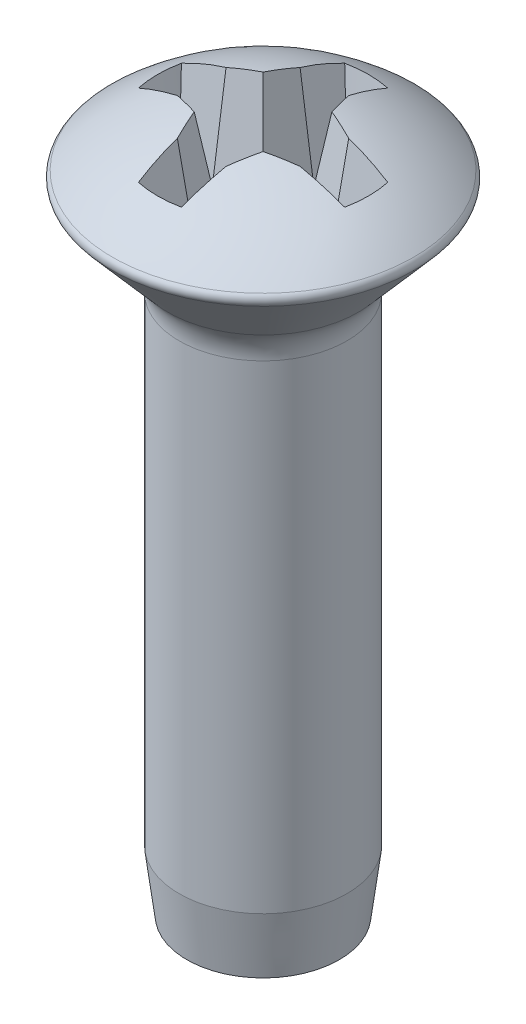
ISO-10303-21;
HEADER;
FILE_DESCRIPTION(('STEP AP214'),'2;1');
FILE_NAME('part.step','',(''),(''),'','','');
FILE_SCHEMA(('AUTOMOTIVE_DESIGN { 1 0 10303 214 1 1 1 1 }'));
ENDSEC;
DATA;
#1=APPLICATION_CONTEXT('core data for automotive mechanical design processes');
#2=APPLICATION_PROTOCOL_DEFINITION('international standard','automotive_design',2000,#1);
#3=PRODUCT_CONTEXT('',#1,'mechanical');
#4=PRODUCT('Part','Part','',(#3));
#5=PRODUCT_RELATED_PRODUCT_CATEGORY('part','',(#4));
#6=PRODUCT_DEFINITION_FORMATION('','',#4);
#7=PRODUCT_DEFINITION_CONTEXT('part definition',#1,'design');
#8=PRODUCT_DEFINITION('design','',#6,#7);
#9=PRODUCT_DEFINITION_SHAPE('','',#8);
#10=(LENGTH_UNIT() NAMED_UNIT(*) SI_UNIT(.MILLI.,.METRE.));
#11=(NAMED_UNIT(*) PLANE_ANGLE_UNIT() SI_UNIT($,.RADIAN.));
#12=(NAMED_UNIT(*) SI_UNIT($,.STERADIAN.) SOLID_ANGLE_UNIT());
#13=UNCERTAINTY_MEASURE_WITH_UNIT(LENGTH_MEASURE(1.E-05),#10,'distance_accuracy_value','');
#14=(GEOMETRIC_REPRESENTATION_CONTEXT(3) GLOBAL_UNCERTAINTY_ASSIGNED_CONTEXT((#13)) GLOBAL_UNIT_ASSIGNED_CONTEXT((#10,
#11,#12)) REPRESENTATION_CONTEXT('',''));
#15=CARTESIAN_POINT('',(0.,0.,0.));
#16=DIRECTION('',(0.,0.,1.));
#17=DIRECTION('',(1.,0.,0.));
#18=AXIS2_PLACEMENT_3D('',#15,#16,#17);
#19=CARTESIAN_POINT('',(0.,1.15804939418114,0.));
#20=DIRECTION('',(0.,-1.,0.));
#21=DIRECTION('',(0.,0.,-1.));
#22=AXIS2_PLACEMENT_3D('',#19,#20,#21);
#23=TOROIDAL_SURFACE('',#22,2.42533374712076,0.127);
#24=CARTESIAN_POINT('',(0.,1.25428371989489,0.));
#25=DIRECTION('',(0.,-1.,0.));
#26=DIRECTION('',(0.,0.,1.));
#27=AXIS2_PLACEMENT_3D('',#24,#25,#26);
#28=CIRCLE('',#27,2.50820687035393);
#29=CARTESIAN_POINT('',(0.,1.25428371989488,-2.50820687035393));
#30=VERTEX_POINT('',#29);
#31=EDGE_CURVE('E11',#30,#30,#28,.T.);
#32=ORIENTED_EDGE('',*,*,#31,.T.);
#33=EDGE_LOOP('',(#32));
#34=FACE_BOUND('',#33,.T.);
#35=CARTESIAN_POINT('',(0.,1.07472989749934,0.));
#36=DIRECTION('',(0.,1.,0.));
#37=DIRECTION('',(0.,0.,1.));
#38=AXIS2_PLACEMENT_3D('',#35,#36,#37);
#39=CIRCLE('',#38,2.52118186380905);
#40=CARTESIAN_POINT('',(0.,1.07472989749934,-2.52118186380905));
#41=VERTEX_POINT('',#40);
#42=EDGE_CURVE('E28',#41,#41,#39,.T.);
#43=ORIENTED_EDGE('',*,*,#42,.T.);
#44=EDGE_LOOP('',(#43));
#45=FACE_BOUND('',#44,.T.);
#46=ADVANCED_FACE('F17',(#34,#45),#23,.T.);
#47=CARTESIAN_POINT('',(0.,0.584713040357369,0.));
#48=DIRECTION('',(0.,1.,0.));
#49=DIRECTION('',(0.,0.,-1.));
#50=AXIS2_PLACEMENT_3D('',#47,#48,#49);
#51=CONICAL_SURFACE('',#50,2.09521670858914,0.715584993319999);
#52=CARTESIAN_POINT('',(0.,0.,0.));
#53=DIRECTION('',(0.,-1.,0.));
#54=DIRECTION('',(1.,0.,0.));
#55=AXIS2_PLACEMENT_3D('',#52,#53,#54);
#56=CIRCLE('',#55,1.58693341717828);
#57=CARTESIAN_POINT('',(0.,0.,-1.58693341717828));
#58=VERTEX_POINT('',#57);
#59=EDGE_CURVE('E353',#58,#58,#56,.T.);
#60=ORIENTED_EDGE('',*,*,#59,.F.);
#61=EDGE_LOOP('',(#60));
#62=FACE_BOUND('',#61,.T.);
#63=ORIENTED_EDGE('',*,*,#42,.F.);
#64=EDGE_LOOP('',(#63));
#65=FACE_BOUND('',#64,.T.);
#66=ADVANCED_FACE('F687',(#62,#65),#51,.T.);
#67=CARTESIAN_POINT('',(0.,-1.65830829428524,0.));
#68=DIRECTION('',(0.,0.,1.));
#69=DIRECTION('',(1.,0.,0.));
#70=AXIS2_PLACEMENT_3D('',#67,#68,#69);
#71=SPHERICAL_SURFACE('',#70,3.84373437499997);
#72=ORIENTED_EDGE('',*,*,#31,.F.);
#73=EDGE_LOOP('',(#72));
#74=FACE_BOUND('',#73,.T.);
#75=CARTESIAN_POINT('',(-0.0610638255064502,-1.66969899003309,0.0210795939230976));
#76=DIRECTION('',(-0.930902049821273,-0.17364817766693,0.321352896410639));
#77=DIRECTION('',(-0.326310282821926,0.,-0.94526271444751));
#78=AXIS2_PLACEMENT_3D('',#75,#76,#77);
#79=CIRCLE('',#78,3.84317460669449);
#80=CARTESIAN_POINT('',(-0.404857301362302,2.02498035128735,1.02165026525036));
#81=VERTEX_POINT('',#80);
#82=CARTESIAN_POINT('',(-0.573390965933572,2.09891668512816,0.57339096593357));
#83=VERTEX_POINT('',#82);
#84=EDGE_CURVE('E458',#81,#83,#79,.T.);
#85=ORIENTED_EDGE('',*,*,#84,.T.);
#86=CARTESIAN_POINT('',(-0.0210795939230979,-1.66969899003309,0.0610638255064509));
#87=DIRECTION('',(-0.321352896410639,-0.173648177666929,0.930902049821273));
#88=DIRECTION('',(0.,0.983043138329356,0.183374448011631));
#89=AXIS2_PLACEMENT_3D('',#86,#87,#88);
#90=CIRCLE('',#89,3.84317460669449);
#91=CARTESIAN_POINT('',(-1.02165026525037,2.02498035128735,0.404857301362299));
#92=VERTEX_POINT('',#91);
#93=EDGE_CURVE('E192',#83,#92,#90,.T.);
#94=ORIENTED_EDGE('',*,*,#93,.T.);
#95=CARTESIAN_POINT('',(0.,-1.61647822785268,-0.237230095272393));
#96=DIRECTION('',(0.,-0.173648177666929,0.984807753012208));
#97=DIRECTION('',(0.,0.984807753012208,0.173648177666929));
#98=AXIS2_PLACEMENT_3D('',#95,#96,#97);
#99=CIRCLE('',#98,3.8361785767865);
#100=CARTESIAN_POINT('',(-1.71837950576436,1.76120246910407,0.358346143819249));
#101=VERTEX_POINT('',#100);
#102=EDGE_CURVE('E203',#92,#101,#99,.T.);
#103=ORIENTED_EDGE('',*,*,#102,.T.);
#104=CARTESIAN_POINT('',(0.,1.76120246910407,0.));
#105=DIRECTION('',(0.,-1.,0.));
#106=DIRECTION('',(0.988094813743472,0.,0.153846153846154));
#107=AXIS2_PLACEMENT_3D('',#104,#105,#106);
#108=CIRCLE('',#107,1.75534614381925);
#109=CARTESIAN_POINT('',(-1.71837950576436,1.76120246910407,-0.358346143819256));
#110=VERTEX_POINT('',#109);
#111=EDGE_CURVE('E361',#101,#110,#108,.T.);
#112=ORIENTED_EDGE('',*,*,#111,.T.);
#113=CARTESIAN_POINT('',(0.,-1.61647822785268,0.237230095272398));
#114=DIRECTION('',(0.,-0.173648177666932,-0.984807753012208));
#115=DIRECTION('',(0.,-0.984807753012208,0.173648177666932));
#116=AXIS2_PLACEMENT_3D('',#113,#114,#115);
#117=CIRCLE('',#116,3.8361785767865);
#118=CARTESIAN_POINT('',(-1.02165026525037,2.02498035128735,-0.404857301362304));
#119=VERTEX_POINT('',#118);
#120=EDGE_CURVE('E383',#110,#119,#117,.T.);
#121=ORIENTED_EDGE('',*,*,#120,.T.);
#122=CARTESIAN_POINT('',(-0.0210795939230965,-1.66969899003309,-0.0610638255064471));
#123=DIRECTION('',(-0.321352896410639,-0.173648177666932,-0.930902049821272));
#124=DIRECTION('',(0.,-0.983043138329356,0.183374448011634));
#125=AXIS2_PLACEMENT_3D('',#122,#123,#124);
#126=CIRCLE('',#125,3.84317460669449);
#127=CARTESIAN_POINT('',(-0.573390965933572,2.09891668512816,-0.573390965933575));
#128=VERTEX_POINT('',#127);
#129=EDGE_CURVE('E481',#119,#128,#126,.T.);
#130=ORIENTED_EDGE('',*,*,#129,.T.);
#131=CARTESIAN_POINT('',(-0.0610638255064481,-1.66969899003309,-0.0210795939230969));
#132=DIRECTION('',(-0.930902049821273,-0.173648177666931,-0.321352896410639));
#133=DIRECTION('',(0.326310282821926,0.,-0.94526271444751));
#134=AXIS2_PLACEMENT_3D('',#131,#132,#133);
#135=CIRCLE('',#134,3.84317460669449);
#136=CARTESIAN_POINT('',(-0.404857301362302,2.02498035128734,-1.02165026525037));
#137=VERTEX_POINT('',#136);
#138=EDGE_CURVE('E488',#128,#137,#135,.T.);
#139=ORIENTED_EDGE('',*,*,#138,.T.);
#140=CARTESIAN_POINT('',(0.237230095272395,-1.61647822785268,0.));
#141=DIRECTION('',(-0.984807753012208,-0.17364817766693,0.));
#142=DIRECTION('',(0.,0.,-1.));
#143=AXIS2_PLACEMENT_3D('',#140,#141,#142);
#144=CIRCLE('',#143,3.8361785767865);
#145=CARTESIAN_POINT('',(-0.358346143819251,1.76120246910407,-1.71837950576437));
#146=VERTEX_POINT('',#145);
#147=EDGE_CURVE('E503',#137,#146,#144,.T.);
#148=ORIENTED_EDGE('',*,*,#147,.T.);
#149=CARTESIAN_POINT('',(0.,1.76120246910407,0.));
#150=DIRECTION('',(0.,-1.,0.));
#151=DIRECTION('',(-0.153846153846154,0.,0.988094813743472));
#152=AXIS2_PLACEMENT_3D('',#149,#150,#151);
#153=CIRCLE('',#152,1.75534614381925);
#154=CARTESIAN_POINT('',(0.358346143819251,1.76120246910407,-1.71837950576437));
#155=VERTEX_POINT('',#154);
#156=EDGE_CURVE('E219',#146,#155,#153,.T.);
#157=ORIENTED_EDGE('',*,*,#156,.T.);
#158=CARTESIAN_POINT('',(-0.237230095272395,-1.61647822785268,0.));
#159=DIRECTION('',(0.984807753012208,-0.17364817766693,0.));
#160=DIRECTION('',(0.,0.,1.));
#161=AXIS2_PLACEMENT_3D('',#158,#159,#160);
#162=CIRCLE('',#161,3.8361785767865);
#163=CARTESIAN_POINT('',(0.404857301362302,2.02498035128735,-1.02165026525037));
#164=VERTEX_POINT('',#163);
#165=EDGE_CURVE('E234',#155,#164,#162,.T.);
#166=ORIENTED_EDGE('',*,*,#165,.T.);
#167=CARTESIAN_POINT('',(0.0610638255064484,-1.66969899003309,-0.0210795939230971));
#168=DIRECTION('',(0.930902049821273,-0.173648177666931,-0.321352896410639));
#169=DIRECTION('',(0.326310282821926,0.,0.94526271444751));
#170=AXIS2_PLACEMENT_3D('',#167,#168,#169);
#171=CIRCLE('',#170,3.84317460669449);
#172=CARTESIAN_POINT('',(0.573390965933572,2.09891668512816,-0.573390965933575));
#173=VERTEX_POINT('',#172);
#174=EDGE_CURVE('E376',#164,#173,#171,.T.);
#175=ORIENTED_EDGE('',*,*,#174,.T.);
#176=CARTESIAN_POINT('',(0.0210795939230965,-1.66969899003309,-0.0610638255064469));
#177=DIRECTION('',(0.321352896410639,-0.173648177666932,-0.930902049821272));
#178=DIRECTION('',(0.,-0.983043138329356,0.183374448011634));
#179=AXIS2_PLACEMENT_3D('',#176,#177,#178);
#180=CIRCLE('',#179,3.84317460669449);
#181=CARTESIAN_POINT('',(1.02165026525037,2.02498035128735,-0.404857301362304));
#182=VERTEX_POINT('',#181);
#183=EDGE_CURVE('E372',#173,#182,#180,.T.);
#184=ORIENTED_EDGE('',*,*,#183,.T.);
#185=CARTESIAN_POINT('',(0.,-1.61647822785268,0.237230095272397));
#186=DIRECTION('',(0.,-0.173648177666932,-0.984807753012208));
#187=DIRECTION('',(0.,-0.984807753012208,0.173648177666932));
#188=AXIS2_PLACEMENT_3D('',#185,#186,#187);
#189=CIRCLE('',#188,3.8361785767865);
#190=CARTESIAN_POINT('',(1.71837950576436,1.76120246910407,-0.358346143819256));
#191=VERTEX_POINT('',#190);
#192=EDGE_CURVE('E365',#182,#191,#189,.T.);
#193=ORIENTED_EDGE('',*,*,#192,.T.);
#194=CARTESIAN_POINT('',(0.,1.76120246910407,0.));
#195=DIRECTION('',(0.,-1.,0.));
#196=DIRECTION('',(-0.988094813743472,0.,-0.153846153846154));
#197=AXIS2_PLACEMENT_3D('',#194,#195,#196);
#198=CIRCLE('',#197,1.75534614381925);
#199=CARTESIAN_POINT('',(1.71837950576436,1.76120246910407,0.358346143819249));
#200=VERTEX_POINT('',#199);
#201=EDGE_CURVE('E362',#191,#200,#198,.T.);
#202=ORIENTED_EDGE('',*,*,#201,.T.);
#203=CARTESIAN_POINT('',(0.,-1.61647822785268,-0.237230095272393));
#204=DIRECTION('',(0.,-0.173648177666929,0.984807753012208));
#205=DIRECTION('',(0.,0.984807753012208,0.173648177666929));
#206=AXIS2_PLACEMENT_3D('',#203,#204,#205);
#207=CIRCLE('',#206,3.8361785767865);
#208=CARTESIAN_POINT('',(1.02165026525037,2.02498035128735,0.404857301362299));
#209=VERTEX_POINT('',#208);
#210=EDGE_CURVE('E315',#200,#209,#207,.T.);
#211=ORIENTED_EDGE('',*,*,#210,.T.);
#212=CARTESIAN_POINT('',(0.0210795939230981,-1.66969899003309,0.0610638255064514));
#213=DIRECTION('',(0.321352896410639,-0.173648177666929,0.930902049821273));
#214=DIRECTION('',(0.,0.983043138329356,0.183374448011631));
#215=AXIS2_PLACEMENT_3D('',#212,#213,#214);
#216=CIRCLE('',#215,3.84317460669449);
#217=CARTESIAN_POINT('',(0.573390965933572,2.09891668512816,0.57339096593357));
#218=VERTEX_POINT('',#217);
#219=EDGE_CURVE('E309',#209,#218,#216,.T.);
#220=ORIENTED_EDGE('',*,*,#219,.T.);
#221=CARTESIAN_POINT('',(0.0610638255064497,-1.66969899003309,0.0210795939230975));
#222=DIRECTION('',(0.930902049821273,-0.17364817766693,0.321352896410639));
#223=DIRECTION('',(-0.326310282821926,0.,0.94526271444751));
#224=AXIS2_PLACEMENT_3D('',#221,#222,#223);
#225=CIRCLE('',#224,3.84317460669449);
#226=CARTESIAN_POINT('',(0.404857301362302,2.02498035128735,1.02165026525037));
#227=VERTEX_POINT('',#226);
#228=EDGE_CURVE('E299',#218,#227,#225,.T.);
#229=ORIENTED_EDGE('',*,*,#228,.T.);
#230=CARTESIAN_POINT('',(-0.237230095272395,-1.61647822785268,0.));
#231=DIRECTION('',(0.984807753012208,-0.17364817766693,0.));
#232=DIRECTION('',(0.,0.,1.));
#233=AXIS2_PLACEMENT_3D('',#230,#231,#232);
#234=CIRCLE('',#233,3.8361785767865);
#235=CARTESIAN_POINT('',(0.358346143819251,1.76120246910407,1.71837950576436));
#236=VERTEX_POINT('',#235);
#237=EDGE_CURVE('E310',#227,#236,#234,.T.);
#238=ORIENTED_EDGE('',*,*,#237,.T.);
#239=CARTESIAN_POINT('',(0.,1.76120246910407,0.));
#240=DIRECTION('',(0.,-1.,0.));
#241=DIRECTION('',(0.153846153846154,0.,-0.988094813743472));
#242=AXIS2_PLACEMENT_3D('',#239,#240,#241);
#243=CIRCLE('',#242,1.75534614381925);
#244=CARTESIAN_POINT('',(-0.358346143819251,1.76120246910407,1.71837950576436));
#245=VERTEX_POINT('',#244);
#246=EDGE_CURVE('E67',#236,#245,#243,.T.);
#247=ORIENTED_EDGE('',*,*,#246,.T.);
#248=CARTESIAN_POINT('',(0.237230095272395,-1.61647822785268,0.));
#249=DIRECTION('',(-0.984807753012208,-0.17364817766693,0.));
#250=DIRECTION('',(0.,0.,-1.));
#251=AXIS2_PLACEMENT_3D('',#248,#249,#250);
#252=CIRCLE('',#251,3.8361785767865);
#253=EDGE_CURVE('E81',#245,#81,#252,.T.);
#254=ORIENTED_EDGE('',*,*,#253,.T.);
#255=EDGE_LOOP('',(#85,#94,#103,#112,#121,#130,#139,#148,#157,#166,#175,#184,#193,#202,#211,
#220,#229,#238,#247,#254));
#256=FACE_BOUND('',#255,.T.);
#257=ADVANCED_FACE('F313',(#74,#256),#71,.T.);
#258=CARTESIAN_POINT('',(-0.99634453749047,1.16942608071473,-0.254));
#259=DIRECTION('',(-0.321352896410639,-0.173648177666932,-0.930902049821272));
#260=DIRECTION('',(-0.94526271444751,0.,0.326310282821926));
#261=AXIS2_PLACEMENT_3D('',#258,#259,#260);
#262=PLANE('',#261);
#263=DIRECTION('',(0.136076471219968,-0.98130850804456,0.136076471219973));
#264=VECTOR('',#263,1.);
#265=CARTESIAN_POINT('',(-0.447845473353487,1.1935517905879,-0.447845473353495));
#266=LINE('',#265,#264);
#267=CARTESIAN_POINT('',(-0.338834686574519,0.407426080714733,-0.338834686574521));
#268=VERTEX_POINT('',#267);
#269=EDGE_CURVE('E480',#128,#268,#266,.T.);
#270=ORIENTED_EDGE('',*,*,#269,.F.);
#271=ORIENTED_EDGE('',*,*,#129,.F.);
#272=DIRECTION('',(0.0291164590928139,-0.984390220157491,0.173574555359313));
#273=VECTOR('',#272,1.);
#274=CARTESIAN_POINT('',(-0.996613703890828,1.1785262522453,-0.255604605769916));
#275=LINE('',#274,#273);
#276=CARTESIAN_POINT('',(-0.973805973642108,0.407426080714733,-0.11963884070015));
#277=VERTEX_POINT('',#276);
#278=EDGE_CURVE('E342',#119,#277,#275,.T.);
#279=ORIENTED_EDGE('',*,*,#278,.T.);
#280=DIRECTION('',(0.94526271444751,0.,-0.326310282821926));
#281=VECTOR('',#280,1.);
#282=CARTESIAN_POINT('',(-0.921082730186928,0.407426080714733,-0.137839216341968));
#283=LINE('',#282,#281);
#284=EDGE_CURVE('E351',#277,#268,#283,.T.);
#285=ORIENTED_EDGE('',*,*,#284,.T.);
#286=EDGE_LOOP('',(#270,#271,#279,#285));
#287=FACE_BOUND('',#286,.T.);
#288=ADVANCED_FACE('F704',(#287),#262,.F.);
#289=CARTESIAN_POINT('',(0.,-9.49857391928526,0.));
#290=DIRECTION('',(0.,-1.,0.));
#291=DIRECTION('',(-1.,0.,0.));
#292=AXIS2_PLACEMENT_3D('',#289,#290,#291);
#293=PLANE('',#292);
#294=CARTESIAN_POINT('',(0.,-9.49857391928526,0.));
#295=DIRECTION('',(0.,-1.,0.));
#296=DIRECTION('',(1.,0.,0.));
#297=AXIS2_PLACEMENT_3D('',#294,#295,#296);
#298=CIRCLE('',#297,1.27000000000002);
#299=CARTESIAN_POINT('',(0.,-9.49857391928526,-1.27));
#300=VERTEX_POINT('',#299);
#301=EDGE_CURVE('E389',#300,#300,#298,.T.);
#302=ORIENTED_EDGE('',*,*,#301,.T.);
#303=EDGE_LOOP('',(#302));
#304=FACE_BOUND('',#303,.T.);
#305=ADVANCED_FACE('F711',(#304),#293,.T.);
#306=CARTESIAN_POINT('',(0.,-8.99057391928526,0.));
#307=DIRECTION('',(0.,1.,0.));
#308=DIRECTION('',(0.,0.,-1.));
#309=AXIS2_PLACEMENT_3D('',#306,#307,#308);
#310=CONICAL_SURFACE('',#309,1.33350000000002,0.124354994547168);
#311=CARTESIAN_POINT('',(0.,-8.48257391928526,0.));
#312=DIRECTION('',(0.,-1.,0.));
#313=DIRECTION('',(1.,0.,0.));
#314=AXIS2_PLACEMENT_3D('',#311,#312,#313);
#315=CIRCLE('',#314,1.39700000000002);
#316=CARTESIAN_POINT('',(0.,-8.48257391928526,-1.397));
#317=VERTEX_POINT('',#316);
#318=EDGE_CURVE('E392',#317,#317,#315,.T.);
#319=ORIENTED_EDGE('',*,*,#318,.T.);
#320=EDGE_LOOP('',(#319));
#321=FACE_BOUND('',#320,.T.);
#322=ORIENTED_EDGE('',*,*,#301,.F.);
#323=EDGE_LOOP('',(#322));
#324=FACE_BOUND('',#323,.T.);
#325=ADVANCED_FACE('F668',(#321,#324),#310,.T.);
#326=CARTESIAN_POINT('',(0.,-4.49528695964265,0.));
#327=DIRECTION('',(0.,-1.,0.));
#328=DIRECTION('',(0.,0.,-1.));
#329=AXIS2_PLACEMENT_3D('',#326,#327,#328);
#330=CYLINDRICAL_SURFACE('',#329,1.397);
#331=CARTESIAN_POINT('',(0.,-0.508,0.));
#332=DIRECTION('',(0.,-1.,0.));
#333=DIRECTION('',(1.,0.,0.));
#334=AXIS2_PLACEMENT_3D('',#331,#332,#333);
#335=CIRCLE('',#334,1.397);
#336=CARTESIAN_POINT('',(0.,-0.508,-1.397));
#337=VERTEX_POINT('',#336);
#338=EDGE_CURVE('E357',#337,#337,#335,.T.);
#339=ORIENTED_EDGE('',*,*,#338,.T.);
#340=EDGE_LOOP('',(#339));
#341=FACE_BOUND('',#340,.T.);
#342=ORIENTED_EDGE('',*,*,#318,.F.);
#343=EDGE_LOOP('',(#342));
#344=FACE_BOUND('',#343,.T.);
#345=ADVANCED_FACE('F663',(#341,#344),#330,.T.);
#346=CARTESIAN_POINT('',(0.,-0.508,0.));
#347=DIRECTION('',(0.,-1.,0.));
#348=DIRECTION('',(0.,0.,-1.));
#349=AXIS2_PLACEMENT_3D('',#346,#347,#348);
#350=TOROIDAL_SURFACE('',#349,2.17132056804656,0.774320568046554);
#351=ORIENTED_EDGE('',*,*,#59,.T.);
#352=EDGE_LOOP('',(#351));
#353=FACE_BOUND('',#352,.T.);
#354=ORIENTED_EDGE('',*,*,#338,.F.);
#355=EDGE_LOOP('',(#354));
#356=FACE_BOUND('',#355,.T.);
#357=ADVANCED_FACE('F667',(#353,#356),#350,.F.);
#358=CARTESIAN_POINT('',(0.254,1.16942608071473,-0.99634453749047));
#359=DIRECTION('',(0.930902049821272,-0.173648177666932,-0.321352896410639));
#360=DIRECTION('',(0.,-0.879770742032779,0.475398192532422));
#361=AXIS2_PLACEMENT_3D('',#358,#359,#360);
#362=PLANE('',#361);
#363=DIRECTION('',(-0.173574555359313,-0.984390220157491,0.0291164590928138));
#364=VECTOR('',#363,1.);
#365=CARTESIAN_POINT('',(0.255604605769916,1.1785262522453,-0.996613703890828));
#366=LINE('',#365,#364);
#367=CARTESIAN_POINT('',(0.119638840700151,0.407426080714733,-0.973805973642108));
#368=VERTEX_POINT('',#367);
#369=EDGE_CURVE('E358',#164,#368,#366,.T.);
#370=ORIENTED_EDGE('',*,*,#369,.T.);
#371=DIRECTION('',(0.326310282821926,0.,0.94526271444751));
#372=VECTOR('',#371,1.);
#373=CARTESIAN_POINT('',(0.222498946259776,0.407426080714733,-0.675838585827029));
#374=LINE('',#373,#372);
#375=CARTESIAN_POINT('',(0.338834686574521,0.407426080714733,-0.338834686574519));
#376=VERTEX_POINT('',#375);
#377=EDGE_CURVE('E444',#368,#376,#374,.T.);
#378=ORIENTED_EDGE('',*,*,#377,.T.);
#379=DIRECTION('',(-0.13607647121997,-0.98130850804456,0.136076471219972));
#380=VECTOR('',#379,1.);
#381=CARTESIAN_POINT('',(0.44784547335349,1.1935517905879,-0.447845473353493));
#382=LINE('',#381,#380);
#383=EDGE_CURVE('E585',#173,#376,#382,.T.);
#384=ORIENTED_EDGE('',*,*,#383,.F.);
#385=ORIENTED_EDGE('',*,*,#174,.F.);
#386=EDGE_LOOP('',(#370,#378,#384,#385));
#387=FACE_BOUND('',#386,.T.);
#388=ADVANCED_FACE('F750',(#387),#362,.F.);
#389=CARTESIAN_POINT('',(0.254,1.16942608071473,-1.63134453749047));
#390=DIRECTION('',(0.984807753012208,-0.173648177666932,0.));
#391=DIRECTION('',(0.,0.,-1.));
#392=AXIS2_PLACEMENT_3D('',#389,#390,#391);
#393=PLANE('',#392);
#394=CARTESIAN_POINT('',(0.254000000027734,1.16942608086822,-1.63134453748473));
#395=CARTESIAN_POINT('',(0.184266812805073,0.773949523948352,-1.57162860359604));
#396=CARTESIAN_POINT('',(0.119638840700803,0.407426080714649,-1.51191266970736));
#397=(BOUNDED_CURVE() B_SPLINE_CURVE(2,(#394,#395,#396),.UNSPECIFIED.,.F.,
.F.) B_SPLINE_CURVE_WITH_KNOTS((3,3),(95.6740604264731,96.224944300469),
.UNSPECIFIED.) CURVE() GEOMETRIC_REPRESENTATION_ITEM() RATIONAL_B_SPLINE_CURVE((1.,1.,1.)) REPRESENTATION_ITEM(''));
#398=CARTESIAN_POINT('',(0.254,1.16942608071473,-1.63134453749047));
#399=VERTEX_POINT('',#398);
#400=CARTESIAN_POINT('',(0.11963884070015,0.407426080714731,-1.51191266973864));
#401=VERTEX_POINT('',#400);
#402=EDGE_CURVE('E438',#399,#401,#397,.T.);
#403=ORIENTED_EDGE('',*,*,#402,.T.);
#404=DIRECTION('',(0.,0.,1.));
#405=VECTOR('',#404,1.);
#406=CARTESIAN_POINT('',(0.119638840700151,0.407426080714733,-0.815672268745235));
#407=LINE('',#406,#405);
#408=EDGE_CURVE('E445',#401,#368,#407,.T.);
#409=ORIENTED_EDGE('',*,*,#408,.T.);
#410=ORIENTED_EDGE('',*,*,#369,.F.);
#411=ORIENTED_EDGE('',*,*,#165,.F.);
#412=CARTESIAN_POINT('',(0.254,1.16942608071473,-1.63134453749048));
#413=CARTESIAN_POINT('',(0.304817473179768,1.45762629247805,-1.67486202162742));
#414=CARTESIAN_POINT('',(0.358346143819251,1.76120246910407,-1.71837950576437));
#415=(BOUNDED_CURVE() B_SPLINE_CURVE(2,(#412,#413,#414),.UNSPECIFIED.,.F.,
.F.) B_SPLINE_CURVE_WITH_KNOTS((3,3),(0.016763932456632,0.079717332250229),
.UNSPECIFIED.) CURVE() GEOMETRIC_REPRESENTATION_ITEM() RATIONAL_B_SPLINE_CURVE((1.,1.,1.)) REPRESENTATION_ITEM(''));
#416=EDGE_CURVE('E388',#399,#155,#415,.T.);
#417=ORIENTED_EDGE('',*,*,#416,.F.);
#418=EDGE_LOOP('',(#403,#409,#410,#411,#417));
#419=FACE_BOUND('',#418,.T.);
#420=ADVANCED_FACE('F763',(#419),#393,.F.);
#421=CARTESIAN_POINT('',(0.,1.16942608071473,0.));
#422=DIRECTION('',(0.,1.,0.));
#423=DIRECTION('',(-0.153846153846154,0.,0.988094813743471));
#424=AXIS2_PLACEMENT_3D('',#421,#422,#423);
#425=CONICAL_SURFACE('',#424,1.651,0.1745329252);
#426=CARTESIAN_POINT('',(-0.254000000032359,1.16942608086023,-1.63134453758689));
#427=CARTESIAN_POINT('',(-0.184266812810825,0.773949523946685,-1.57162860370321));
#428=CARTESIAN_POINT('',(-0.119638840706845,0.407426080714624,-1.51191266981954));
#429=(BOUNDED_CURVE() B_SPLINE_CURVE(2,(#426,#427,#428),.UNSPECIFIED.,.F.,
.F.) B_SPLINE_CURVE_WITH_KNOTS((3,3),(95.6740604260513,96.2249443000027),
.UNSPECIFIED.) CURVE() GEOMETRIC_REPRESENTATION_ITEM() RATIONAL_B_SPLINE_CURVE((1.,1.,1.)) REPRESENTATION_ITEM(''));
#430=CARTESIAN_POINT('',(-0.254,1.16942608071474,-1.63134453749047));
#431=VERTEX_POINT('',#430);
#432=CARTESIAN_POINT('',(-0.119638840700149,0.407426080714731,-1.51191266973864));
#433=VERTEX_POINT('',#432);
#434=EDGE_CURVE('E387',#431,#433,#429,.T.);
#435=ORIENTED_EDGE('',*,*,#434,.T.);
#436=CARTESIAN_POINT('',(0.,0.407426080714733,0.));
#437=DIRECTION('',(0.,-1.,0.));
#438=DIRECTION('',(-0.153846153846154,0.,0.988094813743471));
#439=AXIS2_PLACEMENT_3D('',#436,#437,#438);
#440=CIRCLE('',#439,1.51663884070015);
#441=EDGE_CURVE('E384',#433,#401,#440,.T.);
#442=ORIENTED_EDGE('',*,*,#441,.T.);
#443=ORIENTED_EDGE('',*,*,#402,.F.);
#444=ORIENTED_EDGE('',*,*,#416,.T.);
#445=ORIENTED_EDGE('',*,*,#156,.F.);
#446=CARTESIAN_POINT('',(-0.254,1.16942608071473,-1.63134453749048));
#447=CARTESIAN_POINT('',(-0.304817473179775,1.4576262924781,-1.67486202162743));
#448=CARTESIAN_POINT('',(-0.358346143819251,1.76120246910407,-1.71837950576437));
#449=(BOUNDED_CURVE() B_SPLINE_CURVE(2,(#446,#447,#448),.UNSPECIFIED.,.F.,
.F.) B_SPLINE_CURVE_WITH_KNOTS((3,3),(0.0167639324566251,0.0797173322502094),
.UNSPECIFIED.) CURVE() GEOMETRIC_REPRESENTATION_ITEM() RATIONAL_B_SPLINE_CURVE((1.,1.,1.)) REPRESENTATION_ITEM(''));
#450=EDGE_CURVE('E457',#431,#146,#449,.T.);
#451=ORIENTED_EDGE('',*,*,#450,.F.);
#452=EDGE_LOOP('',(#435,#442,#443,#444,#445,#451));
#453=FACE_BOUND('',#452,.T.);
#454=ADVANCED_FACE('F776',(#453),#425,.F.);
#455=CARTESIAN_POINT('',(-0.254,1.16942608071474,-0.99634453749047));
#456=DIRECTION('',(-0.984807753012208,-0.173648177666929,0.));
#457=DIRECTION('',(-0.173648177666929,0.984807753012208,0.));
#458=AXIS2_PLACEMENT_3D('',#455,#456,#457);
#459=PLANE('',#458);
#460=DIRECTION('',(0.17357455535931,-0.984390220157491,0.029116459092814));
#461=VECTOR('',#460,1.);
#462=CARTESIAN_POINT('',(-0.255475226973573,1.17779250862978,-0.996592001099062));
#463=LINE('',#462,#461);
#464=CARTESIAN_POINT('',(-0.119638840700149,0.407426080714733,-0.973805973642108));
#465=VERTEX_POINT('',#464);
#466=EDGE_CURVE('E456',#137,#465,#463,.T.);
#467=ORIENTED_EDGE('',*,*,#466,.T.);
#468=DIRECTION('',(0.,0.,-1.));
#469=VECTOR('',#468,1.);
#470=CARTESIAN_POINT('',(-0.119638840700149,0.407426080714733,-0.498172268745235));
#471=LINE('',#470,#469);
#472=EDGE_CURVE('E452',#465,#433,#471,.T.);
#473=ORIENTED_EDGE('',*,*,#472,.T.);
#474=ORIENTED_EDGE('',*,*,#434,.F.);
#475=ORIENTED_EDGE('',*,*,#450,.T.);
#476=ORIENTED_EDGE('',*,*,#147,.F.);
#477=EDGE_LOOP('',(#467,#473,#474,#475,#476));
#478=FACE_BOUND('',#477,.T.);
#479=ADVANCED_FACE('F787',(#478),#459,.F.);
#480=CARTESIAN_POINT('',(-0.4445,1.16942608071474,-0.4445));
#481=DIRECTION('',(-0.930902049821273,-0.173648177666929,-0.321352896410639));
#482=DIRECTION('',(-0.326310282821926,0.,0.94526271444751));
#483=AXIS2_PLACEMENT_3D('',#480,#481,#482);
#484=PLANE('',#483);
#485=ORIENTED_EDGE('',*,*,#269,.T.);
#486=DIRECTION('',(0.326310282821926,0.,-0.94526271444751));
#487=VECTOR('',#486,1.);
#488=CARTESIAN_POINT('',(-0.407013771799127,0.407426080714733,-0.141332031706824));
#489=LINE('',#488,#487);
#490=EDGE_CURVE('E571',#268,#465,#489,.T.);
#491=ORIENTED_EDGE('',*,*,#490,.T.);
#492=ORIENTED_EDGE('',*,*,#466,.F.);
#493=ORIENTED_EDGE('',*,*,#138,.F.);
#494=EDGE_LOOP('',(#485,#491,#492,#493));
#495=FACE_BOUND('',#494,.T.);
#496=ADVANCED_FACE('F798',(#495),#484,.F.);
#497=CARTESIAN_POINT('',(0.99634453749047,1.16942608071473,0.254));
#498=DIRECTION('',(0.321352896410639,-0.173648177666932,0.930902049821273));
#499=DIRECTION('',(-0.475398192532422,-0.879770742032779,0.));
#500=AXIS2_PLACEMENT_3D('',#497,#498,#499);
#501=PLANE('',#500);
#502=DIRECTION('',(-0.0291164590928139,-0.984390220157491,-0.173574555359313));
#503=VECTOR('',#502,1.);
#504=CARTESIAN_POINT('',(0.996613703890828,1.1785262522453,0.255604605769916));
#505=LINE('',#504,#503);
#506=CARTESIAN_POINT('',(0.973805973642108,0.407426080714733,0.119638840700151));
#507=VERTEX_POINT('',#506);
#508=EDGE_CURVE('E339',#209,#507,#505,.T.);
#509=ORIENTED_EDGE('',*,*,#508,.T.);
#510=DIRECTION('',(-0.94526271444751,0.,0.326310282821926));
#511=VECTOR('',#510,1.);
#512=CARTESIAN_POINT('',(0.17201015609216,0.407426080714736,0.396423501716936));
#513=LINE('',#512,#511);
#514=CARTESIAN_POINT('',(0.338834686574519,0.407426080714736,0.338834686574521));
#515=VERTEX_POINT('',#514);
#516=EDGE_CURVE('E322',#507,#515,#513,.T.);
#517=ORIENTED_EDGE('',*,*,#516,.T.);
#518=DIRECTION('',(-0.13607647121997,-0.981308508044561,-0.136076471219969));
#519=VECTOR('',#518,1.);
#520=CARTESIAN_POINT('',(0.44784547335349,1.1935517905879,0.44784547335349));
#521=LINE('',#520,#519);
#522=EDGE_CURVE('E304',#218,#515,#521,.T.);
#523=ORIENTED_EDGE('',*,*,#522,.F.);
#524=ORIENTED_EDGE('',*,*,#219,.F.);
#525=EDGE_LOOP('',(#509,#517,#523,#524));
#526=FACE_BOUND('',#525,.T.);
#527=ADVANCED_FACE('F321',(#526),#501,.F.);
#528=CARTESIAN_POINT('',(1.63134453749047,1.16942608071473,0.254));
#529=DIRECTION('',(0.,-0.173648177666932,0.984807753012208));
#530=DIRECTION('',(-1.,0.,0.));
#531=AXIS2_PLACEMENT_3D('',#528,#529,#530);
#532=PLANE('',#531);
#533=CARTESIAN_POINT('',(1.63134453748147,1.16942608086878,0.254000000027932));
#534=CARTESIAN_POINT('',(1.57162860359262,0.773949523948613,0.184266812805214));
#535=CARTESIAN_POINT('',(1.51191266970376,0.407426080714743,0.119638840700914));
#536=(BOUNDED_CURVE() B_SPLINE_CURVE(2,(#533,#534,#535),.UNSPECIFIED.,.F.,
.F.) B_SPLINE_CURVE_WITH_KNOTS((3,3),(95.6740604264853,96.2249443004827),
.UNSPECIFIED.) CURVE() GEOMETRIC_REPRESENTATION_ITEM() RATIONAL_B_SPLINE_CURVE((1.,1.,1.)) REPRESENTATION_ITEM(''));
#537=CARTESIAN_POINT('',(1.63134453749047,1.16942608071473,0.254));
#538=VERTEX_POINT('',#537);
#539=CARTESIAN_POINT('',(1.51191266973864,0.407426080714733,0.119638840700151));
#540=VERTEX_POINT('',#539);
#541=EDGE_CURVE('E370',#538,#540,#536,.T.);
#542=ORIENTED_EDGE('',*,*,#541,.T.);
#543=DIRECTION('',(-1.,0.,0.));
#544=VECTOR('',#543,1.);
#545=CARTESIAN_POINT('',(0.396503568928175,0.407426080714733,0.11963884070015));
#546=LINE('',#545,#544);
#547=EDGE_CURVE('E366',#540,#507,#546,.T.);
#548=ORIENTED_EDGE('',*,*,#547,.T.);
#549=ORIENTED_EDGE('',*,*,#508,.F.);
#550=ORIENTED_EDGE('',*,*,#210,.F.);
#551=CARTESIAN_POINT('',(1.63134453749048,1.16942608071473,0.254));
#552=CARTESIAN_POINT('',(1.67486202162742,1.45762629247806,0.304817473179765));
#553=CARTESIAN_POINT('',(1.71837950576436,1.76120246910407,0.358346143819249));
#554=(BOUNDED_CURVE() B_SPLINE_CURVE(2,(#551,#552,#553),.UNSPECIFIED.,.F.,
.F.) B_SPLINE_CURVE_WITH_KNOTS((3,3),(0.016763932456632,0.079717332250229),
.UNSPECIFIED.) CURVE() GEOMETRIC_REPRESENTATION_ITEM() RATIONAL_B_SPLINE_CURVE((1.,1.,1.)) REPRESENTATION_ITEM(''));
#555=EDGE_CURVE('E550',#538,#200,#554,.T.);
#556=ORIENTED_EDGE('',*,*,#555,.F.);
#557=EDGE_LOOP('',(#542,#548,#549,#550,#556));
#558=FACE_BOUND('',#557,.T.);
#559=ADVANCED_FACE('F639',(#558),#532,.F.);
#560=CARTESIAN_POINT('',(0.,1.16942608071473,0.));
#561=DIRECTION('',(0.,1.,0.));
#562=DIRECTION('',(-0.988094813743471,0.,-0.153846153846154));
#563=AXIS2_PLACEMENT_3D('',#560,#561,#562);
#564=CONICAL_SURFACE('',#563,1.651,0.1745329252);
#565=CARTESIAN_POINT('',(1.63134453758693,1.16942608086023,-0.254000000032403));
#566=CARTESIAN_POINT('',(1.57162860370325,0.773949523946668,-0.184266812810858));
#567=CARTESIAN_POINT('',(1.51191266981958,0.407426080714596,-0.119638840706877));
#568=(BOUNDED_CURVE() B_SPLINE_CURVE(2,(#565,#566,#567),.UNSPECIFIED.,.F.,
.F.) B_SPLINE_CURVE_WITH_KNOTS((3,3),(95.6740604260513,96.2249443000027),
.UNSPECIFIED.) CURVE() GEOMETRIC_REPRESENTATION_ITEM() RATIONAL_B_SPLINE_CURVE((1.,1.,1.)) REPRESENTATION_ITEM(''));
#569=CARTESIAN_POINT('',(1.63134453749047,1.16942608071474,-0.254));
#570=VERTEX_POINT('',#569);
#571=CARTESIAN_POINT('',(1.51191266973864,0.407426080714733,-0.119638840700149));
#572=VERTEX_POINT('',#571);
#573=EDGE_CURVE('E371',#570,#572,#568,.T.);
#574=ORIENTED_EDGE('',*,*,#573,.T.);
#575=CARTESIAN_POINT('',(0.,0.407426080714733,0.));
#576=DIRECTION('',(0.,-1.,0.));
#577=DIRECTION('',(-0.988094813743471,0.,-0.153846153846154));
#578=AXIS2_PLACEMENT_3D('',#575,#576,#577);
#579=CIRCLE('',#578,1.51663884070015);
#580=EDGE_CURVE('E494',#572,#540,#579,.T.);
#581=ORIENTED_EDGE('',*,*,#580,.T.);
#582=ORIENTED_EDGE('',*,*,#541,.F.);
#583=ORIENTED_EDGE('',*,*,#555,.T.);
#584=ORIENTED_EDGE('',*,*,#201,.F.);
#585=CARTESIAN_POINT('',(1.63134453749047,1.16942608071473,-0.254));
#586=CARTESIAN_POINT('',(1.67486202162743,1.4576262924781,-0.304817473179778));
#587=CARTESIAN_POINT('',(1.71837950576436,1.76120246910407,-0.358346143819256));
#588=(BOUNDED_CURVE() B_SPLINE_CURVE(2,(#585,#586,#587),.UNSPECIFIED.,.F.,
.F.) B_SPLINE_CURVE_WITH_KNOTS((3,3),(0.0167639324566251,0.0797173322502094),
.UNSPECIFIED.) CURVE() GEOMETRIC_REPRESENTATION_ITEM() RATIONAL_B_SPLINE_CURVE((1.,1.,1.)) REPRESENTATION_ITEM(''));
#589=EDGE_CURVE('E562',#570,#191,#588,.T.);
#590=ORIENTED_EDGE('',*,*,#589,.F.);
#591=EDGE_LOOP('',(#574,#581,#582,#583,#584,#590));
#592=FACE_BOUND('',#591,.T.);
#593=ADVANCED_FACE('F19',(#592),#564,.F.);
#594=CARTESIAN_POINT('',(0.99634453749047,1.16942608071474,-0.254));
#595=DIRECTION('',(0.,-0.173648177666929,-0.984807753012208));
#596=DIRECTION('',(0.,-0.984807753012208,0.173648177666929));
#597=AXIS2_PLACEMENT_3D('',#594,#595,#596);
#598=PLANE('',#597);
#599=DIRECTION('',(-0.029116459092814,-0.984390220157491,0.17357455535931));
#600=VECTOR('',#599,1.);
#601=CARTESIAN_POINT('',(0.996592001099062,1.17779250862978,-0.255475226973573));
#602=LINE('',#601,#600);
#603=CARTESIAN_POINT('',(0.973805973642108,0.407426080714733,-0.119638840700149));
#604=VERTEX_POINT('',#603);
#605=EDGE_CURVE('E543',#182,#604,#602,.T.);
#606=ORIENTED_EDGE('',*,*,#605,.T.);
#607=DIRECTION('',(1.,0.,0.));
#608=VECTOR('',#607,1.);
#609=CARTESIAN_POINT('',(0.079003568928176,0.407426080714733,-0.119638840700149));
#610=LINE('',#609,#608);
#611=EDGE_CURVE('E21',#604,#572,#610,.T.);
#612=ORIENTED_EDGE('',*,*,#611,.T.);
#613=ORIENTED_EDGE('',*,*,#573,.F.);
#614=ORIENTED_EDGE('',*,*,#589,.T.);
#615=ORIENTED_EDGE('',*,*,#192,.F.);
#616=EDGE_LOOP('',(#606,#612,#613,#614,#615));
#617=FACE_BOUND('',#616,.T.);
#618=ADVANCED_FACE('F644',(#617),#598,.F.);
#619=CARTESIAN_POINT('',(0.4445,1.16942608071474,-0.4445));
#620=DIRECTION('',(0.321352896410639,-0.173648177666929,-0.930902049821273));
#621=DIRECTION('',(0.,-0.983043138329356,0.18337444801163));
#622=AXIS2_PLACEMENT_3D('',#619,#620,#621);
#623=PLANE('',#622);
#624=ORIENTED_EDGE('',*,*,#383,.T.);
#625=DIRECTION('',(0.94526271444751,0.,0.326310282821926));
#626=VECTOR('',#625,1.);
#627=CARTESIAN_POINT('',(-0.103912112653075,0.407426080714733,-0.491673501716935));
#628=LINE('',#627,#626);
#629=EDGE_CURVE('E568',#376,#604,#628,.T.);
#630=ORIENTED_EDGE('',*,*,#629,.T.);
#631=ORIENTED_EDGE('',*,*,#605,.F.);
#632=ORIENTED_EDGE('',*,*,#183,.F.);
#633=EDGE_LOOP('',(#624,#630,#631,#632));
#634=FACE_BOUND('',#633,.T.);
#635=ADVANCED_FACE('F843',(#634),#623,.F.);
#636=CARTESIAN_POINT('',(-0.254,1.16942608071473,0.99634453749047));
#637=DIRECTION('',(-0.930902049821272,-0.173648177666932,0.321352896410639));
#638=DIRECTION('',(-0.183374448011634,0.983043138329356,0.));
#639=AXIS2_PLACEMENT_3D('',#636,#637,#638);
#640=PLANE('',#639);
#641=DIRECTION('',(0.173574555359313,-0.984390220157491,-0.0291164590928139));
#642=VECTOR('',#641,1.);
#643=CARTESIAN_POINT('',(-0.255604605769916,1.1785262522453,0.996613703890828));
#644=LINE('',#643,#642);
#645=CARTESIAN_POINT('',(-0.119638840700151,0.407426080714736,0.973805973642108));
#646=VERTEX_POINT('',#645);
#647=EDGE_CURVE('E465',#81,#646,#644,.T.);
#648=ORIENTED_EDGE('',*,*,#647,.T.);
#649=DIRECTION('',(-0.326310282821926,0.,-0.94526271444751));
#650=VECTOR('',#649,1.);
#651=CARTESIAN_POINT('',(-0.311763771799129,0.407426080714736,0.417254300452059));
#652=LINE('',#651,#650);
#653=CARTESIAN_POINT('',(-0.338834686574521,0.407426080714736,0.338834686574519));
#654=VERTEX_POINT('',#653);
#655=EDGE_CURVE('E461',#646,#654,#652,.T.);
#656=ORIENTED_EDGE('',*,*,#655,.T.);
#657=DIRECTION('',(0.13607647121997,-0.981308508044561,-0.136076471219969));
#658=VECTOR('',#657,1.);
#659=CARTESIAN_POINT('',(-0.44784547335349,1.1935517905879,0.44784547335349));
#660=LINE('',#659,#658);
#661=EDGE_CURVE('E437',#83,#654,#660,.T.);
#662=ORIENTED_EDGE('',*,*,#661,.F.);
#663=ORIENTED_EDGE('',*,*,#84,.F.);
#664=EDGE_LOOP('',(#648,#656,#662,#663));
#665=FACE_BOUND('',#664,.T.);
#666=ADVANCED_FACE('F853',(#665),#640,.F.);
#667=CARTESIAN_POINT('',(-0.254,1.16942608071473,1.63134453749047));
#668=DIRECTION('',(-0.984807753012208,-0.173648177666932,0.));
#669=DIRECTION('',(-0.173648177666932,0.984807753012208,0.));
#670=AXIS2_PLACEMENT_3D('',#667,#668,#669);
#671=PLANE('',#670);
#672=CARTESIAN_POINT('',(-0.254000000028008,1.16942608086938,1.63134453747988));
#673=CARTESIAN_POINT('',(-0.184266812805217,0.773949523948801,1.57162860359091));
#674=CARTESIAN_POINT('',(-0.119638840700863,0.407426080714624,1.51191266970194));
#675=(BOUNDED_CURVE() B_SPLINE_CURVE(2,(#672,#673,#674),.UNSPECIFIED.,.F.,
.F.) B_SPLINE_CURVE_WITH_KNOTS((3,3),(95.6740604264913,96.2249443004899),
.UNSPECIFIED.) CURVE() GEOMETRIC_REPRESENTATION_ITEM() RATIONAL_B_SPLINE_CURVE((1.,1.,1.)) REPRESENTATION_ITEM(''));
#676=CARTESIAN_POINT('',(-0.254,1.16942608071473,1.63134453749047));
#677=VERTEX_POINT('',#676);
#678=CARTESIAN_POINT('',(-0.119638840700151,0.407426080714739,1.51191266973864));
#679=VERTEX_POINT('',#678);
#680=EDGE_CURVE('E466',#677,#679,#675,.T.);
#681=ORIENTED_EDGE('',*,*,#680,.T.);
#682=DIRECTION('',(0.,0.,-1.));
#683=VECTOR('',#682,1.);
#684=CARTESIAN_POINT('',(-0.119638840700151,0.407426080714736,0.815672268745235));
#685=LINE('',#684,#683);
#686=EDGE_CURVE('E412',#679,#646,#685,.T.);
#687=ORIENTED_EDGE('',*,*,#686,.T.);
#688=ORIENTED_EDGE('',*,*,#647,.F.);
#689=ORIENTED_EDGE('',*,*,#253,.F.);
#690=CARTESIAN_POINT('',(-0.254,1.16942608071474,1.63134453749047));
#691=CARTESIAN_POINT('',(-0.304817473179765,1.45762629247806,1.67486202162742));
#692=CARTESIAN_POINT('',(-0.358346143819251,1.76120246910407,1.71837950576436));
#693=(BOUNDED_CURVE() B_SPLINE_CURVE(2,(#690,#691,#692),.UNSPECIFIED.,.F.,
.F.) B_SPLINE_CURVE_WITH_KNOTS((3,3),(0.016763932456632,0.079717332250229),
.UNSPECIFIED.) CURVE() GEOMETRIC_REPRESENTATION_ITEM() RATIONAL_B_SPLINE_CURVE((1.,1.,1.)) REPRESENTATION_ITEM(''));
#694=EDGE_CURVE('E533',#677,#245,#693,.T.);
#695=ORIENTED_EDGE('',*,*,#694,.F.);
#696=EDGE_LOOP('',(#681,#687,#688,#689,#695));
#697=FACE_BOUND('',#696,.T.);
#698=ADVANCED_FACE('F864',(#697),#671,.F.);
#699=CARTESIAN_POINT('',(0.,1.16942608071473,0.));
#700=DIRECTION('',(0.,1.,0.));
#701=DIRECTION('',(0.153846153846154,0.,-0.988094813743471));
#702=AXIS2_PLACEMENT_3D('',#699,#700,#701);
#703=CONICAL_SURFACE('',#702,1.651,0.1745329252);
#704=CARTESIAN_POINT('',(0.254000000032359,1.16942608086023,1.63134453758697));
#705=CARTESIAN_POINT('',(0.184266812810825,0.773949523946685,1.57162860370329));
#706=CARTESIAN_POINT('',(0.119638840706845,0.407426080714624,1.51191266981962));
#707=(BOUNDED_CURVE() B_SPLINE_CURVE(2,(#704,#705,#706),.UNSPECIFIED.,.F.,
.F.) B_SPLINE_CURVE_WITH_KNOTS((3,3),(95.6740604260513,96.2249443000027),
.UNSPECIFIED.) CURVE() GEOMETRIC_REPRESENTATION_ITEM() RATIONAL_B_SPLINE_CURVE((1.,1.,1.)) REPRESENTATION_ITEM(''));
#708=CARTESIAN_POINT('',(0.254,1.16942608071474,1.63134453749047));
#709=VERTEX_POINT('',#708);
#710=CARTESIAN_POINT('',(0.119638840700149,0.407426080714736,1.51191266973864));
#711=VERTEX_POINT('',#710);
#712=EDGE_CURVE('E415',#709,#711,#707,.T.);
#713=ORIENTED_EDGE('',*,*,#712,.T.);
#714=CARTESIAN_POINT('',(0.,0.407426080714736,0.));
#715=DIRECTION('',(0.,-1.,0.));
#716=DIRECTION('',(0.153846153846154,0.,-0.988094813743471));
#717=AXIS2_PLACEMENT_3D('',#714,#715,#716);
#718=CIRCLE('',#717,1.51663884070015);
#719=EDGE_CURVE('E421',#711,#679,#718,.T.);
#720=ORIENTED_EDGE('',*,*,#719,.T.);
#721=ORIENTED_EDGE('',*,*,#680,.F.);
#722=ORIENTED_EDGE('',*,*,#694,.T.);
#723=ORIENTED_EDGE('',*,*,#246,.F.);
#724=CARTESIAN_POINT('',(0.254,1.16942608071474,1.63134453749047));
#725=CARTESIAN_POINT('',(0.304817473179775,1.4576262924781,1.67486202162742));
#726=CARTESIAN_POINT('',(0.358346143819251,1.76120246910407,1.71837950576436));
#727=(BOUNDED_CURVE() B_SPLINE_CURVE(2,(#724,#725,#726),.UNSPECIFIED.,.F.,
.F.) B_SPLINE_CURVE_WITH_KNOTS((3,3),(0.0167639324566251,0.0797173322502094),
.UNSPECIFIED.) CURVE() GEOMETRIC_REPRESENTATION_ITEM() RATIONAL_B_SPLINE_CURVE((1.,1.,1.)) REPRESENTATION_ITEM(''));
#728=EDGE_CURVE('E325',#709,#236,#727,.T.);
#729=ORIENTED_EDGE('',*,*,#728,.F.);
#730=EDGE_LOOP('',(#713,#720,#721,#722,#723,#729));
#731=FACE_BOUND('',#730,.T.);
#732=ADVANCED_FACE('F875',(#731),#703,.F.);
#733=CARTESIAN_POINT('',(0.254,1.16942608071474,0.99634453749047));
#734=DIRECTION('',(0.984807753012208,-0.173648177666929,0.));
#735=DIRECTION('',(0.,0.,-1.));
#736=AXIS2_PLACEMENT_3D('',#733,#734,#735);
#737=PLANE('',#736);
#738=DIRECTION('',(-0.17357455535931,-0.984390220157491,-0.029116459092814));
#739=VECTOR('',#738,1.);
#740=CARTESIAN_POINT('',(0.255475226973573,1.17779250862978,0.996592001099062));
#741=LINE('',#740,#739);
#742=CARTESIAN_POINT('',(0.119638840700149,0.407426080714736,0.973805973642108));
#743=VERTEX_POINT('',#742);
#744=EDGE_CURVE('E307',#227,#743,#741,.T.);
#745=ORIENTED_EDGE('',*,*,#744,.T.);
#746=DIRECTION('',(0.,0.,1.));
#747=VECTOR('',#746,1.);
#748=CARTESIAN_POINT('',(0.119638840700149,0.407426080714736,0.498172268745235));
#749=LINE('',#748,#747);
#750=EDGE_CURVE('E333',#743,#711,#749,.T.);
#751=ORIENTED_EDGE('',*,*,#750,.T.);
#752=ORIENTED_EDGE('',*,*,#712,.F.);
#753=ORIENTED_EDGE('',*,*,#728,.T.);
#754=ORIENTED_EDGE('',*,*,#237,.F.);
#755=EDGE_LOOP('',(#745,#751,#752,#753,#754));
#756=FACE_BOUND('',#755,.T.);
#757=ADVANCED_FACE('F885',(#756),#737,.F.);
#758=CARTESIAN_POINT('',(0.4445,1.16942608071474,0.4445));
#759=DIRECTION('',(0.930902049821273,-0.173648177666929,0.321352896410639));
#760=DIRECTION('',(0.,-0.879770742032782,-0.475398192532416));
#761=AXIS2_PLACEMENT_3D('',#758,#759,#760);
#762=PLANE('',#761);
#763=ORIENTED_EDGE('',*,*,#522,.T.);
#764=DIRECTION('',(-0.326310282821926,0.,0.94526271444751));
#765=VECTOR('',#764,1.);
#766=CARTESIAN_POINT('',(0.317748946259775,0.407426080714736,0.399916317081793));
#767=LINE('',#766,#765);
#768=EDGE_CURVE('E326',#515,#743,#767,.T.);
#769=ORIENTED_EDGE('',*,*,#768,.T.);
#770=ORIENTED_EDGE('',*,*,#744,.F.);
#771=ORIENTED_EDGE('',*,*,#228,.F.);
#772=EDGE_LOOP('',(#763,#769,#770,#771));
#773=FACE_BOUND('',#772,.T.);
#774=ADVANCED_FACE('F301',(#773),#762,.F.);
#775=CARTESIAN_POINT('',(-1.63134453749047,1.16942608071473,-0.254));
#776=DIRECTION('',(0.,-0.173648177666932,-0.984807753012208));
#777=DIRECTION('',(0.,-0.984807753012208,0.173648177666932));
#778=AXIS2_PLACEMENT_3D('',#775,#776,#777);
#779=PLANE('',#778);
#780=CARTESIAN_POINT('',(-1.63134453748149,1.16942608086878,-0.254000000027932));
#781=CARTESIAN_POINT('',(-1.57162860359264,0.77394952394856,-0.184266812805201));
#782=CARTESIAN_POINT('',(-1.51191266970378,0.407426080714672,-0.119638840700898));
#783=(BOUNDED_CURVE() B_SPLINE_CURVE(2,(#780,#781,#782),.UNSPECIFIED.,.F.,
.F.) B_SPLINE_CURVE_WITH_KNOTS((3,3),(95.6740604264853,96.2249443004828),
.UNSPECIFIED.) CURVE() GEOMETRIC_REPRESENTATION_ITEM() RATIONAL_B_SPLINE_CURVE((1.,1.,1.)) REPRESENTATION_ITEM(''));
#784=CARTESIAN_POINT('',(-1.63134453749047,1.16942608071473,-0.254));
#785=VERTEX_POINT('',#784);
#786=CARTESIAN_POINT('',(-1.51191266973864,0.407426080714733,-0.11963884070015));
#787=VERTEX_POINT('',#786);
#788=EDGE_CURVE('E174',#785,#787,#783,.T.);
#789=ORIENTED_EDGE('',*,*,#788,.T.);
#790=DIRECTION('',(1.,0.,0.));
#791=VECTOR('',#790,1.);
#792=CARTESIAN_POINT('',(-1.2348409685623,0.407426080714733,-0.11963884070015));
#793=LINE('',#792,#791);
#794=EDGE_CURVE('E513',#787,#277,#793,.T.);
#795=ORIENTED_EDGE('',*,*,#794,.T.);
#796=ORIENTED_EDGE('',*,*,#278,.F.);
#797=ORIENTED_EDGE('',*,*,#120,.F.);
#798=CARTESIAN_POINT('',(-1.63134453749048,1.16942608071473,-0.254));
#799=CARTESIAN_POINT('',(-1.67486202162742,1.45762629247805,-0.304817473179768));
#800=CARTESIAN_POINT('',(-1.71837950576436,1.76120246910407,-0.358346143819256));
#801=(BOUNDED_CURVE() B_SPLINE_CURVE(2,(#798,#799,#800),.UNSPECIFIED.,.F.,
.F.) B_SPLINE_CURVE_WITH_KNOTS((3,3),(0.016763932456632,0.079717332250229),
.UNSPECIFIED.) CURVE() GEOMETRIC_REPRESENTATION_ITEM() RATIONAL_B_SPLINE_CURVE((1.,1.,1.)) REPRESENTATION_ITEM(''));
#802=EDGE_CURVE('E422',#785,#110,#801,.T.);
#803=ORIENTED_EDGE('',*,*,#802,.F.);
#804=EDGE_LOOP('',(#789,#795,#796,#797,#803));
#805=FACE_BOUND('',#804,.T.);
#806=ADVANCED_FACE('F904',(#805),#779,.F.);
#807=CARTESIAN_POINT('',(0.,1.16942608071473,0.));
#808=DIRECTION('',(0.,1.,0.));
#809=DIRECTION('',(0.988094813743471,0.,0.153846153846154));
#810=AXIS2_PLACEMENT_3D('',#807,#808,#809);
#811=CONICAL_SURFACE('',#810,1.651,0.1745329252);
#812=CARTESIAN_POINT('',(-1.63134453758691,1.1694260808604,0.254000000032403));
#813=CARTESIAN_POINT('',(-1.57162860370323,0.77394952394681,0.184266812810858));
#814=CARTESIAN_POINT('',(-1.51191266981955,0.407426080714739,0.119638840706877));
#815=(BOUNDED_CURVE() B_SPLINE_CURVE(2,(#812,#813,#814),.UNSPECIFIED.,.F.,
.F.) B_SPLINE_CURVE_WITH_KNOTS((3,3),(95.6740604260513,96.2249443000027),
.UNSPECIFIED.) CURVE() GEOMETRIC_REPRESENTATION_ITEM() RATIONAL_B_SPLINE_CURVE((1.,1.,1.)) REPRESENTATION_ITEM(''));
#816=CARTESIAN_POINT('',(-1.63134453749047,1.16942608071474,0.254));
#817=VERTEX_POINT('',#816);
#818=CARTESIAN_POINT('',(-1.51191266973864,0.407426080714733,0.119638840700149));
#819=VERTEX_POINT('',#818);
#820=EDGE_CURVE('E575',#817,#819,#815,.T.);
#821=ORIENTED_EDGE('',*,*,#820,.T.);
#822=CARTESIAN_POINT('',(0.,0.407426080714733,0.));
#823=DIRECTION('',(0.,-1.,0.));
#824=DIRECTION('',(0.988094813743471,0.,0.153846153846154));
#825=AXIS2_PLACEMENT_3D('',#822,#823,#824);
#826=CIRCLE('',#825,1.51663884070015);
#827=EDGE_CURVE('E163',#819,#787,#826,.T.);
#828=ORIENTED_EDGE('',*,*,#827,.T.);
#829=ORIENTED_EDGE('',*,*,#788,.F.);
#830=ORIENTED_EDGE('',*,*,#802,.T.);
#831=ORIENTED_EDGE('',*,*,#111,.F.);
#832=CARTESIAN_POINT('',(-1.63134453749047,1.16942608071473,0.254));
#833=CARTESIAN_POINT('',(-1.67486202162743,1.4576262924781,0.304817473179773));
#834=CARTESIAN_POINT('',(-1.71837950576436,1.76120246910407,0.358346143819249));
#835=(BOUNDED_CURVE() B_SPLINE_CURVE(2,(#832,#833,#834),.UNSPECIFIED.,.F.,
.F.) B_SPLINE_CURVE_WITH_KNOTS((3,3),(0.0167639324566251,0.0797173322502094),
.UNSPECIFIED.) CURVE() GEOMETRIC_REPRESENTATION_ITEM() RATIONAL_B_SPLINE_CURVE((1.,1.,1.)) REPRESENTATION_ITEM(''));
#836=EDGE_CURVE('E348',#817,#101,#835,.T.);
#837=ORIENTED_EDGE('',*,*,#836,.F.);
#838=EDGE_LOOP('',(#821,#828,#829,#830,#831,#837));
#839=FACE_BOUND('',#838,.T.);
#840=ADVANCED_FACE('F912',(#839),#811,.F.);
#841=CARTESIAN_POINT('',(-0.99634453749047,1.16942608071474,0.254));
#842=DIRECTION('',(0.,-0.173648177666929,0.984807753012208));
#843=DIRECTION('',(-1.,0.,0.));
#844=AXIS2_PLACEMENT_3D('',#841,#842,#843);
#845=PLANE('',#844);
#846=DIRECTION('',(0.029116459092814,-0.984390220157491,-0.17357455535931));
#847=VECTOR('',#846,1.);
#848=CARTESIAN_POINT('',(-0.996592001099062,1.17779250862978,0.255475226973573));
#849=LINE('',#848,#847);
#850=CARTESIAN_POINT('',(-0.973805973642108,0.407426080714733,0.119638840700149));
#851=VERTEX_POINT('',#850);
#852=EDGE_CURVE('E347',#92,#851,#849,.T.);
#853=ORIENTED_EDGE('',*,*,#852,.T.);
#854=DIRECTION('',(-1.,0.,0.));
#855=VECTOR('',#854,1.);
#856=CARTESIAN_POINT('',(-0.917340968562295,0.407426080714733,0.119638840700149));
#857=LINE('',#856,#855);
#858=EDGE_CURVE('E343',#851,#819,#857,.T.);
#859=ORIENTED_EDGE('',*,*,#858,.T.);
#860=ORIENTED_EDGE('',*,*,#820,.F.);
#861=ORIENTED_EDGE('',*,*,#836,.T.);
#862=ORIENTED_EDGE('',*,*,#102,.F.);
#863=EDGE_LOOP('',(#853,#859,#860,#861,#862));
#864=FACE_BOUND('',#863,.T.);
#865=ADVANCED_FACE('F922',(#864),#845,.F.);
#866=CARTESIAN_POINT('',(-0.4445,1.16942608071474,0.4445));
#867=DIRECTION('',(-0.321352896410639,-0.173648177666929,0.930902049821273));
#868=DIRECTION('',(-0.475398192532416,0.879770742032782,0.));
#869=AXIS2_PLACEMENT_3D('',#866,#867,#868);
#870=PLANE('',#869);
#871=ORIENTED_EDGE('',*,*,#661,.T.);
#872=DIRECTION('',(-0.94526271444751,0.,-0.326310282821926));
#873=VECTOR('',#872,1.);
#874=CARTESIAN_POINT('',(-0.645160461441691,0.407426080714736,0.233089216341967));
#875=LINE('',#874,#873);
#876=EDGE_CURVE('E430',#654,#851,#875,.T.);
#877=ORIENTED_EDGE('',*,*,#876,.T.);
#878=ORIENTED_EDGE('',*,*,#852,.F.);
#879=ORIENTED_EDGE('',*,*,#93,.F.);
#880=EDGE_LOOP('',(#871,#877,#878,#879));
#881=FACE_BOUND('',#880,.T.);
#882=ADVANCED_FACE('F931',(#881),#870,.F.);
#883=CARTESIAN_POINT('',(-0.838337399634118,0.407426080714733,0.));
#884=DIRECTION('',(0.,-1.,0.));
#885=DIRECTION('',(-1.,0.,0.));
#886=AXIS2_PLACEMENT_3D('',#883,#884,#885);
#887=PLANE('',#886);
#888=ORIENTED_EDGE('',*,*,#876,.F.);
#889=ORIENTED_EDGE('',*,*,#655,.F.);
#890=ORIENTED_EDGE('',*,*,#686,.F.);
#891=ORIENTED_EDGE('',*,*,#719,.F.);
#892=ORIENTED_EDGE('',*,*,#750,.F.);
#893=ORIENTED_EDGE('',*,*,#768,.F.);
#894=ORIENTED_EDGE('',*,*,#516,.F.);
#895=ORIENTED_EDGE('',*,*,#547,.F.);
#896=ORIENTED_EDGE('',*,*,#580,.F.);
#897=ORIENTED_EDGE('',*,*,#611,.F.);
#898=ORIENTED_EDGE('',*,*,#629,.F.);
#899=ORIENTED_EDGE('',*,*,#377,.F.);
#900=ORIENTED_EDGE('',*,*,#408,.F.);
#901=ORIENTED_EDGE('',*,*,#441,.F.);
#902=ORIENTED_EDGE('',*,*,#472,.F.);
#903=ORIENTED_EDGE('',*,*,#490,.F.);
#904=ORIENTED_EDGE('',*,*,#284,.F.);
#905=ORIENTED_EDGE('',*,*,#794,.F.);
#906=ORIENTED_EDGE('',*,*,#827,.F.);
#907=ORIENTED_EDGE('',*,*,#858,.F.);
#908=EDGE_LOOP('',(#888,#889,#890,#891,#892,#893,#894,#895,#896,#897,#898,#899,#900,#901,#902,
#903,#904,#905,#906,#907));
#909=FACE_BOUND('',#908,.T.);
#910=ADVANCED_FACE('F652',(#909),#887,.F.);
#911=CLOSED_SHELL('',(#46,#66,#257,#288,#305,#325,#345,#357,#388,#420,#454,#479,#496,#527,#559,
#593,#618,#635,#666,#698,#732,#757,#774,#806,#840,#865,#882,#910));
#912=MANIFOLD_SOLID_BREP('B1',#911);
#913=ADVANCED_BREP_SHAPE_REPRESENTATION('',(#18,#912),#14);
#914=SHAPE_DEFINITION_REPRESENTATION(#9,#913);
ENDSEC;
END-ISO-10303-21;
